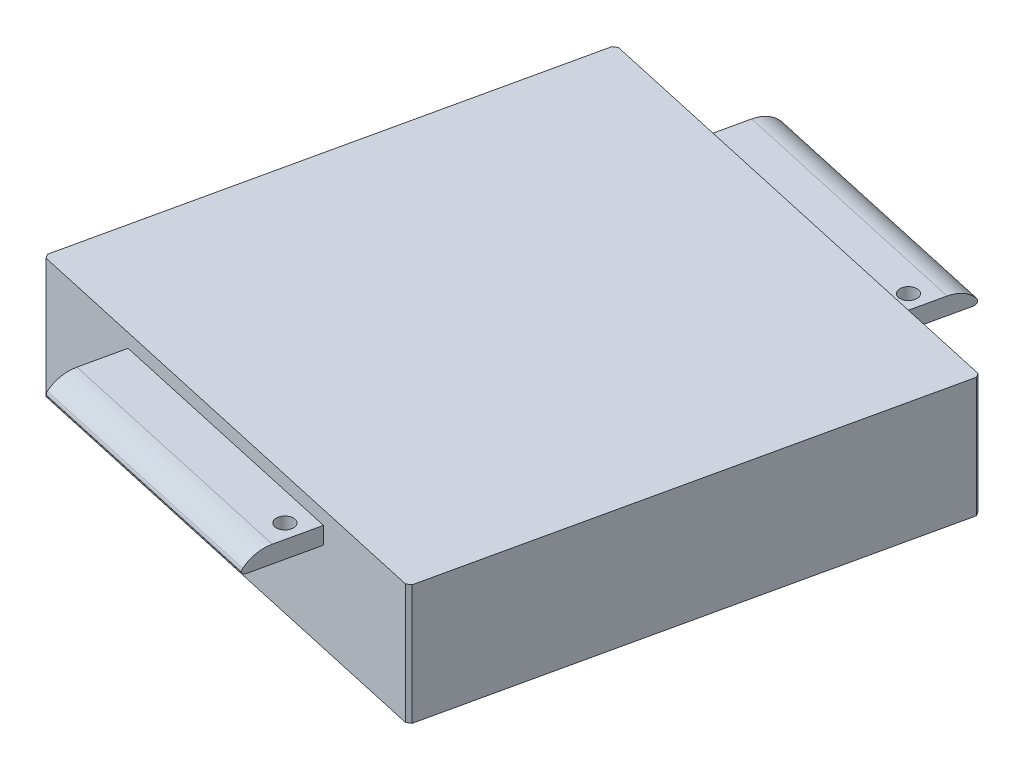
ISO-10303-21;
HEADER;
FILE_DESCRIPTION(('STEP AP214'),'2;1');
FILE_NAME('part.step','',(''),(''),'','','');
FILE_SCHEMA(('AUTOMOTIVE_DESIGN { 1 0 10303 214 1 1 1 1 }'));
ENDSEC;
DATA;
#1=APPLICATION_CONTEXT('core data for automotive mechanical design processes');
#2=APPLICATION_PROTOCOL_DEFINITION('international standard','automotive_design',2000,#1);
#3=PRODUCT_CONTEXT('',#1,'mechanical');
#4=PRODUCT('Part','Part','',(#3));
#5=PRODUCT_RELATED_PRODUCT_CATEGORY('part','',(#4));
#6=PRODUCT_DEFINITION_FORMATION('','',#4);
#7=PRODUCT_DEFINITION_CONTEXT('part definition',#1,'design');
#8=PRODUCT_DEFINITION('design','',#6,#7);
#9=PRODUCT_DEFINITION_SHAPE('','',#8);
#10=(LENGTH_UNIT() NAMED_UNIT(*) SI_UNIT(.MILLI.,.METRE.));
#11=(NAMED_UNIT(*) PLANE_ANGLE_UNIT() SI_UNIT($,.RADIAN.));
#12=(NAMED_UNIT(*) SI_UNIT($,.STERADIAN.) SOLID_ANGLE_UNIT());
#13=UNCERTAINTY_MEASURE_WITH_UNIT(LENGTH_MEASURE(1.E-05),#10,'distance_accuracy_value','');
#14=(GEOMETRIC_REPRESENTATION_CONTEXT(3) GLOBAL_UNCERTAINTY_ASSIGNED_CONTEXT((#13)) GLOBAL_UNIT_ASSIGNED_CONTEXT((#10,
#11,#12)) REPRESENTATION_CONTEXT('',''));
#15=CARTESIAN_POINT('',(0.,0.,0.));
#16=DIRECTION('',(0.,0.,1.));
#17=DIRECTION('',(1.,0.,0.));
#18=AXIS2_PLACEMENT_3D('',#15,#16,#17);
#19=CARTESIAN_POINT('',(-383.630839199916,940.,-1367.07503750893));
#20=DIRECTION('',(-0.216439613938103,0.,0.976296007119933));
#21=DIRECTION('',(0.976296007119933,0.,0.216439613938103));
#22=AXIS2_PLACEMENT_3D('',#19,#20,#21);
#23=PLANE('',#22);
#24=DIRECTION('',(-0.976296007119933,0.,-0.216439613938103));
#25=VECTOR('',#24,1.);
#26=CARTESIAN_POINT('',(-383.630839199916,870.,-1367.07503750893));
#27=LINE('',#26,#25);
#28=CARTESIAN_POINT('',(-383.630839199916,870.,-1367.07503750893));
#29=VERTEX_POINT('',#28);
#30=CARTESIAN_POINT('',(-653.088537165018,870.,-1426.81237095584));
#31=VERTEX_POINT('',#30);
#32=EDGE_CURVE('E235',#29,#31,#27,.T.);
#33=ORIENTED_EDGE('',*,*,#32,.F.);
#34=DIRECTION('',(0.,-1.,0.));
#35=VECTOR('',#34,1.);
#36=CARTESIAN_POINT('',(-383.630839199916,940.,-1367.07503750893));
#37=LINE('',#36,#35);
#38=CARTESIAN_POINT('',(-383.630839199916,940.,-1367.07503750893));
#39=VERTEX_POINT('',#38);
#40=EDGE_CURVE('E11',#39,#29,#37,.T.);
#41=ORIENTED_EDGE('',*,*,#40,.F.);
#42=DIRECTION('',(-0.976296007119933,0.,-0.216439613938103));
#43=VECTOR('',#42,1.);
#44=CARTESIAN_POINT('',(-383.630839199916,940.,-1367.07503750893));
#45=LINE('',#44,#43);
#46=CARTESIAN_POINT('',(-653.088537165018,940.,-1426.81237095584));
#47=VERTEX_POINT('',#46);
#48=EDGE_CURVE('E259',#39,#47,#45,.T.);
#49=ORIENTED_EDGE('',*,*,#48,.T.);
#50=DIRECTION('',(0.,-1.,0.));
#51=VECTOR('',#50,1.);
#52=CARTESIAN_POINT('',(-653.088537165018,940.,-1426.81237095584));
#53=LINE('',#52,#51);
#54=EDGE_CURVE('E25',#47,#31,#53,.T.);
#55=ORIENTED_EDGE('',*,*,#54,.T.);
#56=EDGE_LOOP('',(#33,#41,#49,#55));
#57=FACE_BOUND('',#56,.T.);
#58=DIRECTION('',(-0.976296007119933,0.,-0.216439613938103));
#59=VECTOR('',#58,1.);
#60=CARTESIAN_POINT('',(-445.137487648472,932.,-1380.71073318703));
#61=LINE('',#60,#59);
#62=CARTESIAN_POINT('',(-445.137487648472,932.,-1380.71073318703));
#63=VERTEX_POINT('',#62);
#64=CARTESIAN_POINT('',(-591.581888716462,932.,-1413.17667527774));
#65=VERTEX_POINT('',#64);
#66=EDGE_CURVE('E32',#63,#65,#61,.T.);
#67=ORIENTED_EDGE('',*,*,#66,.F.);
#68=DIRECTION('',(0.,-1.,0.));
#69=VECTOR('',#68,1.);
#70=CARTESIAN_POINT('',(-445.137487648472,932.,-1380.71073318703));
#71=LINE('',#70,#69);
#72=CARTESIAN_POINT('',(-445.137487648472,922.,-1380.71073318703));
#73=VERTEX_POINT('',#72);
#74=EDGE_CURVE('E36',#63,#73,#71,.T.);
#75=ORIENTED_EDGE('',*,*,#74,.T.);
#76=DIRECTION('',(-0.976296007119933,0.,-0.216439613938103));
#77=VECTOR('',#76,1.);
#78=CARTESIAN_POINT('',(-445.137487648472,922.,-1380.71073318703));
#79=LINE('',#78,#77);
#80=CARTESIAN_POINT('',(-591.581888716462,922.,-1413.17667527774));
#81=VERTEX_POINT('',#80);
#82=EDGE_CURVE('E136',#73,#81,#79,.T.);
#83=ORIENTED_EDGE('',*,*,#82,.T.);
#84=DIRECTION('',(0.,-1.,0.));
#85=VECTOR('',#84,1.);
#86=CARTESIAN_POINT('',(-591.581888716462,932.,-1413.17667527774));
#87=LINE('',#86,#85);
#88=EDGE_CURVE('E139',#65,#81,#87,.T.);
#89=ORIENTED_EDGE('',*,*,#88,.F.);
#90=EDGE_LOOP('',(#67,#75,#83,#89));
#91=FACE_BOUND('',#90,.T.);
#92=ADVANCED_FACE('F17',(#57,#91),#23,.T.);
#93=CARTESIAN_POINT('',(-381.2453679578,940.,-1368.59475029529));
#94=DIRECTION('',(0.537299608346824,0.,0.843391445812886));
#95=DIRECTION('',(0.843391445812886,0.,-0.537299608346824));
#96=AXIS2_PLACEMENT_3D('',#93,#94,#95);
#97=PLANE('',#96);
#98=DIRECTION('',(-0.843391445812886,0.,0.537299608346824));
#99=VECTOR('',#98,1.);
#100=CARTESIAN_POINT('',(-381.2453679578,870.,-1368.59475029529));
#101=LINE('',#100,#99);
#102=CARTESIAN_POINT('',(-381.2453679578,870.,-1368.59475029529));
#103=VERTEX_POINT('',#102);
#104=EDGE_CURVE('E232',#103,#29,#101,.T.);
#105=ORIENTED_EDGE('',*,*,#104,.F.);
#106=DIRECTION('',(0.,-1.,0.));
#107=VECTOR('',#106,1.);
#108=CARTESIAN_POINT('',(-381.2453679578,940.,-1368.59475029529));
#109=LINE('',#108,#107);
#110=CARTESIAN_POINT('',(-381.2453679578,940.,-1368.59475029529));
#111=VERTEX_POINT('',#110);
#112=EDGE_CURVE('E280',#111,#103,#109,.T.);
#113=ORIENTED_EDGE('',*,*,#112,.F.);
#114=DIRECTION('',(-0.843391445812886,0.,0.537299608346824));
#115=VECTOR('',#114,1.);
#116=CARTESIAN_POINT('',(-381.2453679578,940.,-1368.59475029529));
#117=LINE('',#116,#115);
#118=EDGE_CURVE('E256',#111,#39,#117,.T.);
#119=ORIENTED_EDGE('',*,*,#118,.T.);
#120=ORIENTED_EDGE('',*,*,#40,.T.);
#121=EDGE_LOOP('',(#105,#113,#119,#120));
#122=FACE_BOUND('',#121,.T.);
#123=ADVANCED_FACE('F19',(#122),#97,.T.);
#124=CARTESIAN_POINT('',(-653.088537165018,940.,-1426.81237095584));
#125=DIRECTION('',(-0.843391445812886,0.,0.537299608346824));
#126=DIRECTION('',(0.537299608346824,0.,0.843391445812886));
#127=AXIS2_PLACEMENT_3D('',#124,#125,#126);
#128=PLANE('',#127);
#129=DIRECTION('',(-0.537299608346824,0.,-0.843391445812886));
#130=VECTOR('',#129,1.);
#131=CARTESIAN_POINT('',(-653.088537165018,870.,-1426.81237095584));
#132=LINE('',#131,#130);
#133=CARTESIAN_POINT('',(-654.608249951381,870.,-1429.19784219796));
#134=VERTEX_POINT('',#133);
#135=EDGE_CURVE('E238',#31,#134,#132,.T.);
#136=ORIENTED_EDGE('',*,*,#135,.F.);
#137=ORIENTED_EDGE('',*,*,#54,.F.);
#138=DIRECTION('',(-0.537299608346824,0.,-0.843391445812886));
#139=VECTOR('',#138,1.);
#140=CARTESIAN_POINT('',(-653.088537165018,940.,-1426.81237095584));
#141=LINE('',#140,#139);
#142=CARTESIAN_POINT('',(-654.608249951381,940.,-1429.19784219796));
#143=VERTEX_POINT('',#142);
#144=EDGE_CURVE('E262',#47,#143,#141,.T.);
#145=ORIENTED_EDGE('',*,*,#144,.T.);
#146=DIRECTION('',(0.,-1.,0.));
#147=VECTOR('',#146,1.);
#148=CARTESIAN_POINT('',(-654.608249951381,940.,-1429.19784219796));
#149=LINE('',#148,#147);
#150=EDGE_CURVE('E292',#143,#134,#149,.T.);
#151=ORIENTED_EDGE('',*,*,#150,.T.);
#152=EDGE_LOOP('',(#136,#137,#145,#151));
#153=FACE_BOUND('',#152,.T.);
#154=ADVANCED_FACE('F299',(#153),#128,.T.);
#155=CARTESIAN_POINT('',(-654.608249951381,940.,-1429.19784219796));
#156=DIRECTION('',(-0.976296007119933,0.,-0.216439613938103));
#157=DIRECTION('',(-0.216439613938103,0.,0.976296007119933));
#158=AXIS2_PLACEMENT_3D('',#155,#156,#157);
#159=PLANE('',#158);
#160=DIRECTION('',(0.216439613938103,0.,-0.976296007119933));
#161=VECTOR('',#160,1.);
#162=CARTESIAN_POINT('',(-654.608249951381,870.,-1429.19784219796));
#163=LINE('',#162,#161);
#164=CARTESIAN_POINT('',(-594.870916504465,870.,-1698.65554016306));
#165=VERTEX_POINT('',#164);
#166=EDGE_CURVE('E241',#134,#165,#163,.T.);
#167=ORIENTED_EDGE('',*,*,#166,.F.);
#168=ORIENTED_EDGE('',*,*,#150,.F.);
#169=DIRECTION('',(0.216439613938103,0.,-0.976296007119933));
#170=VECTOR('',#169,1.);
#171=CARTESIAN_POINT('',(-654.608249951381,940.,-1429.19784219796));
#172=LINE('',#171,#170);
#173=CARTESIAN_POINT('',(-594.870916504465,940.,-1698.65554016306));
#174=VERTEX_POINT('',#173);
#175=EDGE_CURVE('E265',#143,#174,#172,.T.);
#176=ORIENTED_EDGE('',*,*,#175,.T.);
#177=DIRECTION('',(0.,-1.,0.));
#178=VECTOR('',#177,1.);
#179=CARTESIAN_POINT('',(-594.870916504465,940.,-1698.65554016306));
#180=LINE('',#179,#178);
#181=EDGE_CURVE('E290',#174,#165,#180,.T.);
#182=ORIENTED_EDGE('',*,*,#181,.T.);
#183=EDGE_LOOP('',(#167,#168,#176,#182));
#184=FACE_BOUND('',#183,.T.);
#185=ADVANCED_FACE('F314',(#184),#159,.T.);
#186=CARTESIAN_POINT('',(-594.870916504465,940.,-1698.65554016306));
#187=DIRECTION('',(-0.537299608346824,0.,-0.843391445812886));
#188=DIRECTION('',(-0.843391445812886,0.,0.537299608346824));
#189=AXIS2_PLACEMENT_3D('',#186,#187,#188);
#190=PLANE('',#189);
#191=DIRECTION('',(0.843391445812886,0.,-0.537299608346824));
#192=VECTOR('',#191,1.);
#193=CARTESIAN_POINT('',(-594.870916504465,870.,-1698.65554016306));
#194=LINE('',#193,#192);
#195=CARTESIAN_POINT('',(-592.485445262349,870.,-1700.17525294942));
#196=VERTEX_POINT('',#195);
#197=EDGE_CURVE('E244',#165,#196,#194,.T.);
#198=ORIENTED_EDGE('',*,*,#197,.F.);
#199=ORIENTED_EDGE('',*,*,#181,.F.);
#200=DIRECTION('',(0.843391445812886,0.,-0.537299608346824));
#201=VECTOR('',#200,1.);
#202=CARTESIAN_POINT('',(-594.870916504465,940.,-1698.65554016306));
#203=LINE('',#202,#201);
#204=CARTESIAN_POINT('',(-592.485445262349,940.,-1700.17525294942));
#205=VERTEX_POINT('',#204);
#206=EDGE_CURVE('E268',#174,#205,#203,.T.);
#207=ORIENTED_EDGE('',*,*,#206,.T.);
#208=DIRECTION('',(0.,-1.,0.));
#209=VECTOR('',#208,1.);
#210=CARTESIAN_POINT('',(-592.485445262349,940.,-1700.17525294942));
#211=LINE('',#210,#209);
#212=EDGE_CURVE('E288',#205,#196,#211,.T.);
#213=ORIENTED_EDGE('',*,*,#212,.T.);
#214=EDGE_LOOP('',(#198,#199,#207,#213));
#215=FACE_BOUND('',#214,.T.);
#216=ADVANCED_FACE('F318',(#215),#190,.T.);
#217=CARTESIAN_POINT('',(-592.485445262349,940.,-1700.17525294942));
#218=DIRECTION('',(0.216439613938103,0.,-0.976296007119933));
#219=DIRECTION('',(-0.976296007119933,0.,-0.216439613938103));
#220=AXIS2_PLACEMENT_3D('',#217,#218,#219);
#221=PLANE('',#220);
#222=DIRECTION('',(0.,-1.,0.));
#223=VECTOR('',#222,1.);
#224=CARTESIAN_POINT('',(-384.534395745803,932.,-1654.07361518061));
#225=LINE('',#224,#223);
#226=CARTESIAN_POINT('',(-384.534395745803,932.,-1654.07361518061));
#227=VERTEX_POINT('',#226);
#228=CARTESIAN_POINT('',(-384.534395745803,922.,-1654.0736151806));
#229=VERTEX_POINT('',#228);
#230=EDGE_CURVE('E205',#227,#229,#225,.T.);
#231=ORIENTED_EDGE('',*,*,#230,.F.);
#232=DIRECTION('',(-0.976296007119933,0.,-0.216439613938103));
#233=VECTOR('',#232,1.);
#234=CARTESIAN_POINT('',(-384.534395745803,932.,-1654.07361518061));
#235=LINE('',#234,#233);
#236=CARTESIAN_POINT('',(-530.978796813793,932.,-1686.53955727132));
#237=VERTEX_POINT('',#236);
#238=EDGE_CURVE('E230',#227,#237,#235,.T.);
#239=ORIENTED_EDGE('',*,*,#238,.T.);
#240=DIRECTION('',(0.,-1.,0.));
#241=VECTOR('',#240,1.);
#242=CARTESIAN_POINT('',(-530.978796813793,932.,-1686.53955727132));
#243=LINE('',#242,#241);
#244=CARTESIAN_POINT('',(-530.978796813793,922.,-1686.53955727132));
#245=VERTEX_POINT('',#244);
#246=EDGE_CURVE('E191',#237,#245,#243,.T.);
#247=ORIENTED_EDGE('',*,*,#246,.T.);
#248=DIRECTION('',(-0.976296007119933,0.,-0.216439613938103));
#249=VECTOR('',#248,1.);
#250=CARTESIAN_POINT('',(-384.534395745803,922.,-1654.07361518061));
#251=LINE('',#250,#249);
#252=EDGE_CURVE('E227',#229,#245,#251,.T.);
#253=ORIENTED_EDGE('',*,*,#252,.F.);
#254=EDGE_LOOP('',(#231,#239,#247,#253));
#255=FACE_BOUND('',#254,.T.);
#256=DIRECTION('',(0.976296007119933,0.,0.216439613938103));
#257=VECTOR('',#256,1.);
#258=CARTESIAN_POINT('',(-592.485445262349,870.,-1700.17525294942));
#259=LINE('',#258,#257);
#260=CARTESIAN_POINT('',(-323.027747297247,870.,-1640.4379195025));
#261=VERTEX_POINT('',#260);
#262=EDGE_CURVE('E247',#196,#261,#259,.T.);
#263=ORIENTED_EDGE('',*,*,#262,.F.);
#264=ORIENTED_EDGE('',*,*,#212,.F.);
#265=DIRECTION('',(0.976296007119933,0.,0.216439613938103));
#266=VECTOR('',#265,1.);
#267=CARTESIAN_POINT('',(-592.485445262349,940.,-1700.17525294942));
#268=LINE('',#267,#266);
#269=CARTESIAN_POINT('',(-323.027747297247,940.,-1640.4379195025));
#270=VERTEX_POINT('',#269);
#271=EDGE_CURVE('E271',#205,#270,#268,.T.);
#272=ORIENTED_EDGE('',*,*,#271,.T.);
#273=DIRECTION('',(0.,-1.,0.));
#274=VECTOR('',#273,1.);
#275=CARTESIAN_POINT('',(-323.027747297247,940.,-1640.4379195025));
#276=LINE('',#275,#274);
#277=EDGE_CURVE('E286',#270,#261,#276,.T.);
#278=ORIENTED_EDGE('',*,*,#277,.T.);
#279=EDGE_LOOP('',(#263,#264,#272,#278));
#280=FACE_BOUND('',#279,.T.);
#281=ADVANCED_FACE('F320',(#255,#280),#221,.T.);
#282=CARTESIAN_POINT('',(-323.027747297247,940.,-1640.4379195025));
#283=DIRECTION('',(0.843391445812886,0.,-0.537299608346824));
#284=DIRECTION('',(-0.537299608346824,0.,-0.843391445812886));
#285=AXIS2_PLACEMENT_3D('',#282,#283,#284);
#286=PLANE('',#285);
#287=DIRECTION('',(0.537299608346824,0.,0.843391445812886));
#288=VECTOR('',#287,1.);
#289=CARTESIAN_POINT('',(-323.027747297247,870.,-1640.4379195025));
#290=LINE('',#289,#288);
#291=CARTESIAN_POINT('',(-321.508034510883,870.,-1638.05244826039));
#292=VERTEX_POINT('',#291);
#293=EDGE_CURVE('E250',#261,#292,#290,.T.);
#294=ORIENTED_EDGE('',*,*,#293,.F.);
#295=ORIENTED_EDGE('',*,*,#277,.F.);
#296=DIRECTION('',(0.537299608346824,0.,0.843391445812886));
#297=VECTOR('',#296,1.);
#298=CARTESIAN_POINT('',(-323.027747297247,940.,-1640.4379195025));
#299=LINE('',#298,#297);
#300=CARTESIAN_POINT('',(-321.508034510883,940.,-1638.05244826039));
#301=VERTEX_POINT('',#300);
#302=EDGE_CURVE('E274',#270,#301,#299,.T.);
#303=ORIENTED_EDGE('',*,*,#302,.T.);
#304=DIRECTION('',(0.,-1.,0.));
#305=VECTOR('',#304,1.);
#306=CARTESIAN_POINT('',(-321.508034510883,940.,-1638.05244826039));
#307=LINE('',#306,#305);
#308=EDGE_CURVE('E284',#301,#292,#307,.T.);
#309=ORIENTED_EDGE('',*,*,#308,.T.);
#310=EDGE_LOOP('',(#294,#295,#303,#309));
#311=FACE_BOUND('',#310,.T.);
#312=ADVANCED_FACE('F324',(#311),#286,.T.);
#313=CARTESIAN_POINT('',(-321.508034510883,940.,-1638.05244826039));
#314=DIRECTION('',(0.976296007119933,0.,0.216439613938103));
#315=DIRECTION('',(0.216439613938103,0.,-0.976296007119933));
#316=AXIS2_PLACEMENT_3D('',#313,#314,#315);
#317=PLANE('',#316);
#318=DIRECTION('',(-0.216439613938103,0.,0.976296007119933));
#319=VECTOR('',#318,1.);
#320=CARTESIAN_POINT('',(-321.508034510883,870.,-1638.05244826039));
#321=LINE('',#320,#319);
#322=EDGE_CURVE('E253',#292,#103,#321,.T.);
#323=ORIENTED_EDGE('',*,*,#322,.F.);
#324=ORIENTED_EDGE('',*,*,#308,.F.);
#325=DIRECTION('',(-0.216439613938103,0.,0.976296007119933));
#326=VECTOR('',#325,1.);
#327=CARTESIAN_POINT('',(-321.508034510883,940.,-1638.05244826039));
#328=LINE('',#327,#326);
#329=EDGE_CURVE('E277',#301,#111,#328,.T.);
#330=ORIENTED_EDGE('',*,*,#329,.T.);
#331=ORIENTED_EDGE('',*,*,#112,.T.);
#332=EDGE_LOOP('',(#323,#324,#330,#331));
#333=FACE_BOUND('',#332,.T.);
#334=ADVANCED_FACE('F326',(#333),#317,.T.);
#335=CARTESIAN_POINT('',(-548.228354905925,940.,-1262.21485524983));
#336=DIRECTION('',(0.,-1.,0.));
#337=DIRECTION('',(-0.216439613938103,0.,0.976296007119933));
#338=AXIS2_PLACEMENT_3D('',#335,#336,#337);
#339=PLANE('',#338);
#340=ORIENTED_EDGE('',*,*,#118,.F.);
#341=ORIENTED_EDGE('',*,*,#329,.F.);
#342=ORIENTED_EDGE('',*,*,#302,.F.);
#343=ORIENTED_EDGE('',*,*,#271,.F.);
#344=ORIENTED_EDGE('',*,*,#206,.F.);
#345=ORIENTED_EDGE('',*,*,#175,.F.);
#346=ORIENTED_EDGE('',*,*,#144,.F.);
#347=ORIENTED_EDGE('',*,*,#48,.F.);
#348=EDGE_LOOP('',(#340,#341,#342,#343,#344,#345,#346,#347));
#349=FACE_BOUND('',#348,.T.);
#350=ADVANCED_FACE('F308',(#349),#339,.F.);
#351=CARTESIAN_POINT('',(-548.228354905925,870.,-1262.21485524983));
#352=DIRECTION('',(0.,-1.,0.));
#353=DIRECTION('',(-0.216439613938103,0.,0.976296007119933));
#354=AXIS2_PLACEMENT_3D('',#351,#352,#353);
#355=PLANE('',#354);
#356=ORIENTED_EDGE('',*,*,#104,.T.);
#357=ORIENTED_EDGE('',*,*,#32,.T.);
#358=ORIENTED_EDGE('',*,*,#135,.T.);
#359=ORIENTED_EDGE('',*,*,#166,.T.);
#360=ORIENTED_EDGE('',*,*,#197,.T.);
#361=ORIENTED_EDGE('',*,*,#262,.T.);
#362=ORIENTED_EDGE('',*,*,#293,.T.);
#363=ORIENTED_EDGE('',*,*,#322,.T.);
#364=EDGE_LOOP('',(#356,#357,#358,#359,#360,#361,#362,#363));
#365=FACE_BOUND('',#364,.T.);
#366=ADVANCED_FACE('F302',(#365),#355,.T.);
#367=CARTESIAN_POINT('',(-379.123405397351,932.,-1678.4810153586));
#368=DIRECTION('',(0.,1.,0.));
#369=DIRECTION('',(0.216439613938103,0.,-0.976296007119933));
#370=AXIS2_PLACEMENT_3D('',#367,#368,#369);
#371=PLANE('',#370);
#372=CARTESIAN_POINT('',(-391.591860642776,932.,-1668.44171140899));
#373=DIRECTION('',(0.,1.,0.));
#374=DIRECTION('',(0.216439613938103,0.,-0.976296007119933));
#375=AXIS2_PLACEMENT_3D('',#372,#373,#374);
#376=CIRCLE('',#375,5.);
#377=CARTESIAN_POINT('',(-390.509662573086,932.,-1673.32319144458));
#378=VERTEX_POINT('',#377);
#379=EDGE_CURVE('E185',#378,#378,#376,.T.);
#380=ORIENTED_EDGE('',*,*,#379,.F.);
#381=EDGE_LOOP('',(#380));
#382=FACE_BOUND('',#381,.T.);
#383=DIRECTION('',(-0.216439613938103,0.,0.976296007119933));
#384=VECTOR('',#383,1.);
#385=CARTESIAN_POINT('',(-525.567806465341,932.,-1710.94695744932));
#386=LINE('',#385,#384);
#387=CARTESIAN_POINT('',(-525.567806465341,932.,-1710.94695744932));
#388=VERTEX_POINT('',#387);
#389=EDGE_CURVE('E194',#388,#237,#386,.T.);
#390=ORIENTED_EDGE('',*,*,#389,.T.);
#391=ORIENTED_EDGE('',*,*,#238,.F.);
#392=DIRECTION('',(-0.216439613938103,0.,0.976296007119933));
#393=VECTOR('',#392,1.);
#394=CARTESIAN_POINT('',(-379.123405397351,932.,-1678.4810153586));
#395=LINE('',#394,#393);
#396=CARTESIAN_POINT('',(-379.123405397351,932.,-1678.4810153586));
#397=VERTEX_POINT('',#396);
#398=EDGE_CURVE('E202',#397,#227,#395,.T.);
#399=ORIENTED_EDGE('',*,*,#398,.F.);
#400=DIRECTION('',(-0.976296007119933,0.,-0.216439613938103));
#401=VECTOR('',#400,1.);
#402=CARTESIAN_POINT('',(-379.123405397351,932.,-1678.4810153586));
#403=LINE('',#402,#401);
#404=EDGE_CURVE('E216',#397,#388,#403,.T.);
#405=ORIENTED_EDGE('',*,*,#404,.T.);
#406=EDGE_LOOP('',(#390,#391,#399,#405));
#407=FACE_BOUND('',#406,.T.);
#408=ADVANCED_FACE('F359',(#382,#407),#371,.T.);
#409=CARTESIAN_POINT('',(-384.534395745803,922.,-1654.07361518061));
#410=DIRECTION('',(0.,-1.,0.));
#411=DIRECTION('',(-0.216439613938103,0.,0.976296007119933));
#412=AXIS2_PLACEMENT_3D('',#409,#410,#411);
#413=PLANE('',#412);
#414=CARTESIAN_POINT('',(-391.591860642776,922.,-1668.44171140899));
#415=DIRECTION('',(0.,1.,0.));
#416=DIRECTION('',(-0.216439613938103,0.,0.976296007119933));
#417=AXIS2_PLACEMENT_3D('',#414,#415,#416);
#418=CIRCLE('',#417,5.);
#419=CARTESIAN_POINT('',(-392.674058712467,922.,-1663.56023137339));
#420=VERTEX_POINT('',#419);
#421=EDGE_CURVE('E190',#420,#420,#418,.T.);
#422=ORIENTED_EDGE('',*,*,#421,.T.);
#423=EDGE_LOOP('',(#422));
#424=FACE_BOUND('',#423,.T.);
#425=DIRECTION('',(0.216439613938103,0.,-0.976296007119933));
#426=VECTOR('',#425,1.);
#427=CARTESIAN_POINT('',(-530.978796813793,922.,-1686.53955727132));
#428=LINE('',#427,#426);
#429=CARTESIAN_POINT('',(-522.754091484145,922.,-1723.63880554188));
#430=VERTEX_POINT('',#429);
#431=EDGE_CURVE('E193',#245,#430,#428,.T.);
#432=ORIENTED_EDGE('',*,*,#431,.T.);
#433=DIRECTION('',(-0.976296007119933,0.,-0.216439613938103));
#434=VECTOR('',#433,1.);
#435=CARTESIAN_POINT('',(-376.309690416155,922.,-1691.17286345117));
#436=LINE('',#435,#434);
#437=CARTESIAN_POINT('',(-376.309690416155,922.,-1691.17286345117));
#438=VERTEX_POINT('',#437);
#439=EDGE_CURVE('E224',#438,#430,#436,.T.);
#440=ORIENTED_EDGE('',*,*,#439,.F.);
#441=DIRECTION('',(0.216439613938103,0.,-0.976296007119933));
#442=VECTOR('',#441,1.);
#443=CARTESIAN_POINT('',(-384.534395745803,922.,-1654.07361518061));
#444=LINE('',#443,#442);
#445=EDGE_CURVE('E208',#229,#438,#444,.T.);
#446=ORIENTED_EDGE('',*,*,#445,.F.);
#447=ORIENTED_EDGE('',*,*,#252,.T.);
#448=EDGE_LOOP('',(#432,#440,#446,#447));
#449=FACE_BOUND('',#448,.T.);
#450=ADVANCED_FACE('F366',(#424,#449),#413,.T.);
#451=CARTESIAN_POINT('',(-376.309690416155,924.,-1691.17286345117));
#452=DIRECTION('',(-0.976296007119933,0.,-0.216439613938103));
#453=DIRECTION('',(-0.216439613938103,0.,0.976296007119933));
#454=AXIS2_PLACEMENT_3D('',#451,#452,#453);
#455=CYLINDRICAL_SURFACE('',#454,2.);
#456=CARTESIAN_POINT('',(-522.754091484145,924.,-1723.63880554188));
#457=DIRECTION('',(0.976296007119933,0.,0.216439613938103));
#458=DIRECTION('',(0.,-1.,0.));
#459=AXIS2_PLACEMENT_3D('',#456,#457,#458);
#460=CIRCLE('',#459,2.);
#461=CARTESIAN_POINT('',(-522.424046167776,925.294113061495,-1725.12754375702));
#462=VERTEX_POINT('',#461);
#463=EDGE_CURVE('E197',#430,#462,#460,.T.);
#464=ORIENTED_EDGE('',*,*,#463,.T.);
#465=DIRECTION('',(-0.976296007119933,0.,-0.216439613938103));
#466=VECTOR('',#465,1.);
#467=CARTESIAN_POINT('',(-375.979645099786,925.294113061495,-1692.6616016663));
#468=LINE('',#467,#466);
#469=CARTESIAN_POINT('',(-375.979645099786,925.294113061495,-1692.6616016663));
#470=VERTEX_POINT('',#469);
#471=EDGE_CURVE('E221',#470,#462,#468,.T.);
#472=ORIENTED_EDGE('',*,*,#471,.F.);
#473=CARTESIAN_POINT('',(-376.309690416155,924.,-1691.17286345117));
#474=DIRECTION('',(0.976296007119933,0.,0.216439613938103));
#475=DIRECTION('',(0.,-1.,0.));
#476=AXIS2_PLACEMENT_3D('',#473,#474,#475);
#477=CIRCLE('',#476,2.);
#478=EDGE_CURVE('E211',#438,#470,#477,.T.);
#479=ORIENTED_EDGE('',*,*,#478,.F.);
#480=ORIENTED_EDGE('',*,*,#439,.T.);
#481=EDGE_LOOP('',(#464,#472,#479,#480));
#482=FACE_BOUND('',#481,.T.);
#483=ADVANCED_FACE('F369',(#482),#455,.T.);
#484=CARTESIAN_POINT('',(-379.115075605288,913.000038977292,-1678.51858862249));
#485=DIRECTION('',(-0.976296007119933,0.,-0.216439613938103));
#486=DIRECTION('',(-0.216439613938103,0.,0.976296007119933));
#487=AXIS2_PLACEMENT_3D('',#484,#485,#486);
#488=CYLINDRICAL_SURFACE('',#487,19.);
#489=CARTESIAN_POINT('',(-525.559476673278,913.000038977292,-1710.98453071321));
#490=DIRECTION('',(0.976296007119934,0.,0.216439613938104));
#491=DIRECTION('',(-0.00043841010854217,0.999997948563554,0.00197754020469829));
#492=AXIS2_PLACEMENT_3D('',#489,#490,#491);
#493=CIRCLE('',#492,19.);
#494=EDGE_CURVE('E200',#462,#388,#493,.T.);
#495=ORIENTED_EDGE('',*,*,#494,.T.);
#496=ORIENTED_EDGE('',*,*,#404,.F.);
#497=CARTESIAN_POINT('',(-379.115075605288,913.000038977292,-1678.51858862249));
#498=DIRECTION('',(0.976296007119934,0.,0.216439613938104));
#499=DIRECTION('',(-0.00043841010854217,0.999997948563554,0.00197754020469829));
#500=AXIS2_PLACEMENT_3D('',#497,#498,#499);
#501=CIRCLE('',#500,19.);
#502=EDGE_CURVE('E214',#470,#397,#501,.T.);
#503=ORIENTED_EDGE('',*,*,#502,.F.);
#504=ORIENTED_EDGE('',*,*,#471,.T.);
#505=EDGE_LOOP('',(#495,#496,#503,#504));
#506=FACE_BOUND('',#505,.T.);
#507=ADVANCED_FACE('F371',(#506),#488,.T.);
#508=CARTESIAN_POINT('',(-376.309690416155,924.,-1691.17286345117));
#509=DIRECTION('',(-0.976296007119933,0.,-0.216439613938103));
#510=DIRECTION('',(-0.216439613938103,0.,0.976296007119933));
#511=AXIS2_PLACEMENT_3D('',#508,#509,#510);
#512=PLANE('',#511);
#513=ORIENTED_EDGE('',*,*,#398,.T.);
#514=ORIENTED_EDGE('',*,*,#230,.T.);
#515=ORIENTED_EDGE('',*,*,#445,.T.);
#516=ORIENTED_EDGE('',*,*,#478,.T.);
#517=ORIENTED_EDGE('',*,*,#502,.T.);
#518=EDGE_LOOP('',(#513,#514,#515,#516,#517));
#519=FACE_BOUND('',#518,.T.);
#520=ADVANCED_FACE('F356',(#519),#512,.F.);
#521=CARTESIAN_POINT('',(-522.754091484145,924.,-1723.63880554188));
#522=DIRECTION('',(-0.976296007119933,0.,-0.216439613938103));
#523=DIRECTION('',(-0.216439613938103,0.,0.976296007119933));
#524=AXIS2_PLACEMENT_3D('',#521,#522,#523);
#525=PLANE('',#524);
#526=ORIENTED_EDGE('',*,*,#389,.F.);
#527=ORIENTED_EDGE('',*,*,#494,.F.);
#528=ORIENTED_EDGE('',*,*,#463,.F.);
#529=ORIENTED_EDGE('',*,*,#431,.F.);
#530=ORIENTED_EDGE('',*,*,#246,.F.);
#531=EDGE_LOOP('',(#526,#527,#528,#529,#530));
#532=FACE_BOUND('',#531,.T.);
#533=ADVANCED_FACE('F362',(#532),#525,.T.);
#534=CARTESIAN_POINT('',(-391.591860642776,916.999999999951,-1668.44171140899));
#535=DIRECTION('',(0.,1.,0.));
#536=DIRECTION('',(0.216439613938103,0.,-0.976296007119933));
#537=AXIS2_PLACEMENT_3D('',#534,#535,#536);
#538=CYLINDRICAL_SURFACE('',#537,5.);
#539=ORIENTED_EDGE('',*,*,#421,.F.);
#540=EDGE_LOOP('',(#539));
#541=FACE_BOUND('',#540,.T.);
#542=ORIENTED_EDGE('',*,*,#379,.T.);
#543=EDGE_LOOP('',(#542));
#544=FACE_BOUND('',#543,.T.);
#545=ADVANCED_FACE('F434',(#541,#544),#538,.F.);
#546=CARTESIAN_POINT('',(-450.548477996924,932.,-1356.30333300903));
#547=DIRECTION('',(0.,1.,0.));
#548=DIRECTION('',(-0.216439613938103,0.,0.976296007119933));
#549=AXIS2_PLACEMENT_3D('',#546,#547,#548);
#550=PLANE('',#549);
#551=CARTESIAN_POINT('',(-457.605942893897,932.,-1370.67142923741));
#552=DIRECTION('',(0.,-1.,0.));
#553=DIRECTION('',(-0.216439613938103,0.,0.976296007119933));
#554=AXIS2_PLACEMENT_3D('',#551,#552,#553);
#555=CIRCLE('',#554,5.);
#556=CARTESIAN_POINT('',(-458.688140963588,932.,-1365.78994920181));
#557=VERTEX_POINT('',#556);
#558=EDGE_CURVE('E162',#557,#557,#555,.T.);
#559=ORIENTED_EDGE('',*,*,#558,.T.);
#560=EDGE_LOOP('',(#559));
#561=FACE_BOUND('',#560,.T.);
#562=DIRECTION('',(0.216439613938103,0.,-0.976296007119933));
#563=VECTOR('',#562,1.);
#564=CARTESIAN_POINT('',(-596.992879064914,932.,-1388.76927509975));
#565=LINE('',#564,#563);
#566=CARTESIAN_POINT('',(-596.992879064914,932.,-1388.76927509975));
#567=VERTEX_POINT('',#566);
#568=EDGE_CURVE('E157',#567,#65,#565,.T.);
#569=ORIENTED_EDGE('',*,*,#568,.F.);
#570=DIRECTION('',(-0.976296007119933,0.,-0.216439613938103));
#571=VECTOR('',#570,1.);
#572=CARTESIAN_POINT('',(-450.548477996924,932.,-1356.30333300903));
#573=LINE('',#572,#571);
#574=CARTESIAN_POINT('',(-450.548477996924,932.,-1356.30333300903));
#575=VERTEX_POINT('',#574);
#576=EDGE_CURVE('E177',#575,#567,#573,.T.);
#577=ORIENTED_EDGE('',*,*,#576,.F.);
#578=DIRECTION('',(0.216439613938103,0.,-0.976296007119933));
#579=VECTOR('',#578,1.);
#580=CARTESIAN_POINT('',(-450.548477996924,932.,-1356.30333300903));
#581=LINE('',#580,#579);
#582=EDGE_CURVE('E166',#575,#63,#581,.T.);
#583=ORIENTED_EDGE('',*,*,#582,.T.);
#584=ORIENTED_EDGE('',*,*,#66,.T.);
#585=EDGE_LOOP('',(#569,#577,#583,#584));
#586=FACE_BOUND('',#585,.T.);
#587=ADVANCED_FACE('F442',(#561,#586),#550,.T.);
#588=CARTESIAN_POINT('',(-445.137487648472,922.,-1380.71073318703));
#589=DIRECTION('',(0.,-1.,0.));
#590=DIRECTION('',(0.216439613938103,0.,-0.976296007119933));
#591=AXIS2_PLACEMENT_3D('',#588,#589,#590);
#592=PLANE('',#591);
#593=CARTESIAN_POINT('',(-457.605942893897,922.,-1370.67142923741));
#594=DIRECTION('',(0.,-1.,0.));
#595=DIRECTION('',(0.216439613938103,0.,-0.976296007119933));
#596=AXIS2_PLACEMENT_3D('',#593,#594,#595);
#597=CIRCLE('',#596,5.);
#598=CARTESIAN_POINT('',(-456.523744824207,922.,-1375.55290927301));
#599=VERTEX_POINT('',#598);
#600=EDGE_CURVE('E159',#599,#599,#597,.T.);
#601=ORIENTED_EDGE('',*,*,#600,.F.);
#602=EDGE_LOOP('',(#601));
#603=FACE_BOUND('',#602,.T.);
#604=DIRECTION('',(-0.216439613938103,0.,0.976296007119933));
#605=VECTOR('',#604,1.);
#606=CARTESIAN_POINT('',(-591.581888716462,922.,-1413.17667527774));
#607=LINE('',#606,#605);
#608=CARTESIAN_POINT('',(-599.80659404611,922.,-1376.07742700718));
#609=VERTEX_POINT('',#608);
#610=EDGE_CURVE('E146',#81,#609,#607,.T.);
#611=ORIENTED_EDGE('',*,*,#610,.F.);
#612=ORIENTED_EDGE('',*,*,#82,.F.);
#613=DIRECTION('',(-0.216439613938103,0.,0.976296007119933));
#614=VECTOR('',#613,1.);
#615=CARTESIAN_POINT('',(-445.137487648472,922.,-1380.71073318703));
#616=LINE('',#615,#614);
#617=CARTESIAN_POINT('',(-453.36219297812,922.,-1343.61148491647));
#618=VERTEX_POINT('',#617);
#619=EDGE_CURVE('E169',#73,#618,#616,.T.);
#620=ORIENTED_EDGE('',*,*,#619,.T.);
#621=DIRECTION('',(-0.976296007119933,0.,-0.216439613938103));
#622=VECTOR('',#621,1.);
#623=CARTESIAN_POINT('',(-453.36219297812,922.,-1343.61148491647));
#624=LINE('',#623,#622);
#625=EDGE_CURVE('E143',#618,#609,#624,.T.);
#626=ORIENTED_EDGE('',*,*,#625,.T.);
#627=EDGE_LOOP('',(#611,#612,#620,#626));
#628=FACE_BOUND('',#627,.T.);
#629=ADVANCED_FACE('F147',(#603,#628),#592,.T.);
#630=CARTESIAN_POINT('',(-453.36219297812,924.,-1343.61148491647));
#631=DIRECTION('',(-0.976296007119933,0.,-0.216439613938103));
#632=DIRECTION('',(0.216439613938103,0.,-0.976296007119933));
#633=AXIS2_PLACEMENT_3D('',#630,#631,#632);
#634=CYLINDRICAL_SURFACE('',#633,2.);
#635=CARTESIAN_POINT('',(-599.80659404611,924.,-1376.07742700718));
#636=DIRECTION('',(-0.976296007119933,0.,-0.216439613938103));
#637=DIRECTION('',(0.,-1.,0.));
#638=AXIS2_PLACEMENT_3D('',#635,#636,#637);
#639=CIRCLE('',#638,2.);
#640=CARTESIAN_POINT('',(-600.136639362478,925.294113061495,-1374.58868879205));
#641=VERTEX_POINT('',#640);
#642=EDGE_CURVE('E151',#609,#641,#639,.T.);
#643=ORIENTED_EDGE('',*,*,#642,.F.);
#644=ORIENTED_EDGE('',*,*,#625,.F.);
#645=CARTESIAN_POINT('',(-453.36219297812,924.,-1343.61148491647));
#646=DIRECTION('',(-0.976296007119933,0.,-0.216439613938103));
#647=DIRECTION('',(0.,-1.,0.));
#648=AXIS2_PLACEMENT_3D('',#645,#646,#647);
#649=CIRCLE('',#648,2.);
#650=CARTESIAN_POINT('',(-453.692238294488,925.294113061495,-1342.12274670133));
#651=VERTEX_POINT('',#650);
#652=EDGE_CURVE('E171',#618,#651,#649,.T.);
#653=ORIENTED_EDGE('',*,*,#652,.T.);
#654=DIRECTION('',(-0.976296007119933,0.,-0.216439613938103));
#655=VECTOR('',#654,1.);
#656=CARTESIAN_POINT('',(-453.692238294488,925.294113061495,-1342.12274670133));
#657=LINE('',#656,#655);
#658=EDGE_CURVE('E181',#651,#641,#657,.T.);
#659=ORIENTED_EDGE('',*,*,#658,.T.);
#660=EDGE_LOOP('',(#643,#644,#653,#659));
#661=FACE_BOUND('',#660,.T.);
#662=ADVANCED_FACE('F461',(#661),#634,.T.);
#663=CARTESIAN_POINT('',(-450.556807788987,913.000038977292,-1356.26575974514));
#664=DIRECTION('',(-0.976296007119933,0.,-0.216439613938103));
#665=DIRECTION('',(0.216439613938103,0.,-0.976296007119933));
#666=AXIS2_PLACEMENT_3D('',#663,#664,#665);
#667=CYLINDRICAL_SURFACE('',#666,19.);
#668=CARTESIAN_POINT('',(-597.001208856977,913.000038977292,-1388.73170183585));
#669=DIRECTION('',(-0.976296007119934,0.,-0.216439613938103));
#670=DIRECTION('',(0.000438410108544665,0.999997948563554,-0.00197754020469811));
#671=AXIS2_PLACEMENT_3D('',#668,#669,#670);
#672=CIRCLE('',#671,19.);
#673=EDGE_CURVE('E165',#641,#567,#672,.T.);
#674=ORIENTED_EDGE('',*,*,#673,.F.);
#675=ORIENTED_EDGE('',*,*,#658,.F.);
#676=CARTESIAN_POINT('',(-450.556807788987,913.000038977292,-1356.26575974514));
#677=DIRECTION('',(-0.976296007119934,0.,-0.216439613938103));
#678=DIRECTION('',(0.000438410108544665,0.999997948563554,-0.00197754020469811));
#679=AXIS2_PLACEMENT_3D('',#676,#677,#678);
#680=CIRCLE('',#679,19.);
#681=EDGE_CURVE('E174',#651,#575,#680,.T.);
#682=ORIENTED_EDGE('',*,*,#681,.T.);
#683=ORIENTED_EDGE('',*,*,#576,.T.);
#684=EDGE_LOOP('',(#674,#675,#682,#683));
#685=FACE_BOUND('',#684,.T.);
#686=ADVANCED_FACE('F471',(#685),#667,.T.);
#687=CARTESIAN_POINT('',(-453.36219297812,924.,-1343.61148491647));
#688=DIRECTION('',(-0.976296007119933,0.,-0.216439613938103));
#689=DIRECTION('',(0.216439613938103,0.,-0.976296007119933));
#690=AXIS2_PLACEMENT_3D('',#687,#688,#689);
#691=PLANE('',#690);
#692=ORIENTED_EDGE('',*,*,#582,.F.);
#693=ORIENTED_EDGE('',*,*,#681,.F.);
#694=ORIENTED_EDGE('',*,*,#652,.F.);
#695=ORIENTED_EDGE('',*,*,#619,.F.);
#696=ORIENTED_EDGE('',*,*,#74,.F.);
#697=EDGE_LOOP('',(#692,#693,#694,#695,#696));
#698=FACE_BOUND('',#697,.T.);
#699=ADVANCED_FACE('F481',(#698),#691,.F.);
#700=CARTESIAN_POINT('',(-599.80659404611,924.,-1376.07742700718));
#701=DIRECTION('',(-0.976296007119933,0.,-0.216439613938103));
#702=DIRECTION('',(0.216439613938103,0.,-0.976296007119933));
#703=AXIS2_PLACEMENT_3D('',#700,#701,#702);
#704=PLANE('',#703);
#705=ORIENTED_EDGE('',*,*,#568,.T.);
#706=ORIENTED_EDGE('',*,*,#88,.T.);
#707=ORIENTED_EDGE('',*,*,#610,.T.);
#708=ORIENTED_EDGE('',*,*,#642,.T.);
#709=ORIENTED_EDGE('',*,*,#673,.T.);
#710=EDGE_LOOP('',(#705,#706,#707,#708,#709));
#711=FACE_BOUND('',#710,.T.);
#712=ADVANCED_FACE('F154',(#711),#704,.T.);
#713=CARTESIAN_POINT('',(-457.605942893897,916.999999999951,-1370.67142923741));
#714=DIRECTION('',(0.,1.,0.));
#715=DIRECTION('',(-0.216439613938103,0.,0.976296007119933));
#716=AXIS2_PLACEMENT_3D('',#713,#714,#715);
#717=CYLINDRICAL_SURFACE('',#716,5.);
#718=ORIENTED_EDGE('',*,*,#600,.T.);
#719=EDGE_LOOP('',(#718));
#720=FACE_BOUND('',#719,.T.);
#721=ORIENTED_EDGE('',*,*,#558,.F.);
#722=EDGE_LOOP('',(#721));
#723=FACE_BOUND('',#722,.T.);
#724=ADVANCED_FACE('F500',(#720,#723),#717,.F.);
#725=CLOSED_SHELL('',(#92,#123,#154,#185,#216,#281,#312,#334,#350,#366,#408,#450,#483,#507,#520,
#533,#545,#587,#629,#662,#686,#699,#712,#724));
#726=MANIFOLD_SOLID_BREP('B1',#725);
#727=ADVANCED_BREP_SHAPE_REPRESENTATION('',(#18,#726),#14);
#728=SHAPE_DEFINITION_REPRESENTATION(#9,#727);
ENDSEC;
END-ISO-10303-21;
